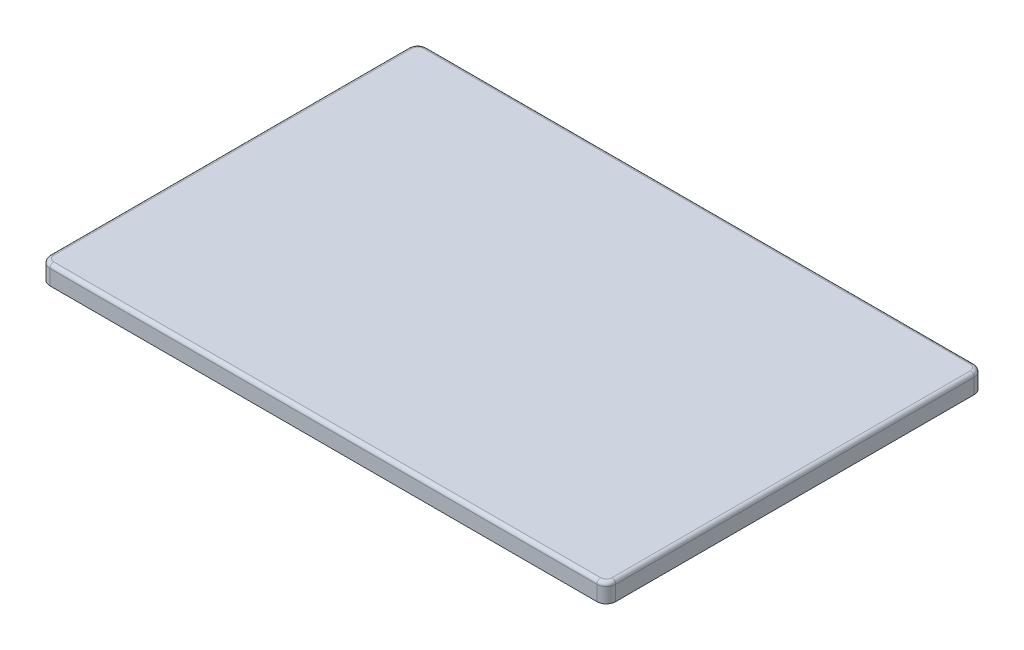
ISO-10303-21;
HEADER;
FILE_DESCRIPTION(('STEP AP214'),'2;1');
FILE_NAME('part.step','',(''),(''),'','','');
FILE_SCHEMA(('AUTOMOTIVE_DESIGN { 1 0 10303 214 1 1 1 1 }'));
ENDSEC;
DATA;
#1=APPLICATION_CONTEXT('core data for automotive mechanical design processes');
#2=APPLICATION_PROTOCOL_DEFINITION('international standard','automotive_design',2000,#1);
#3=PRODUCT_CONTEXT('',#1,'mechanical');
#4=PRODUCT('Part','Part','',(#3));
#5=PRODUCT_RELATED_PRODUCT_CATEGORY('part','',(#4));
#6=PRODUCT_DEFINITION_FORMATION('','',#4);
#7=PRODUCT_DEFINITION_CONTEXT('part definition',#1,'design');
#8=PRODUCT_DEFINITION('design','',#6,#7);
#9=PRODUCT_DEFINITION_SHAPE('','',#8);
#10=(LENGTH_UNIT() NAMED_UNIT(*) SI_UNIT(.MILLI.,.METRE.));
#11=(NAMED_UNIT(*) PLANE_ANGLE_UNIT() SI_UNIT($,.RADIAN.));
#12=(NAMED_UNIT(*) SI_UNIT($,.STERADIAN.) SOLID_ANGLE_UNIT());
#13=UNCERTAINTY_MEASURE_WITH_UNIT(LENGTH_MEASURE(1.E-05),#10,'distance_accuracy_value','');
#14=(GEOMETRIC_REPRESENTATION_CONTEXT(3) GLOBAL_UNCERTAINTY_ASSIGNED_CONTEXT((#13)) GLOBAL_UNIT_ASSIGNED_CONTEXT((#10,
#11,#12)) REPRESENTATION_CONTEXT('',''));
#15=CARTESIAN_POINT('',(0.,0.,0.));
#16=DIRECTION('',(0.,0.,1.));
#17=DIRECTION('',(1.,0.,0.));
#18=AXIS2_PLACEMENT_3D('',#15,#16,#17);
#19=CARTESIAN_POINT('',(145.,0.,-95.));
#20=DIRECTION('',(0.,-1.,0.));
#21=DIRECTION('',(0.,0.,-1.));
#22=AXIS2_PLACEMENT_3D('',#19,#20,#21);
#23=PLANE('',#22);
#24=CARTESIAN_POINT('',(145.,0.,-95.));
#25=DIRECTION('',(0.,1.,0.));
#26=DIRECTION('',(0.,0.,-1.));
#27=AXIS2_PLACEMENT_3D('',#24,#25,#26);
#28=CIRCLE('',#27,5.);
#29=CARTESIAN_POINT('',(150.,0.,-95.));
#30=VERTEX_POINT('',#29);
#31=CARTESIAN_POINT('',(145.,0.,-100.));
#32=VERTEX_POINT('',#31);
#33=EDGE_CURVE('E198',#30,#32,#28,.T.);
#34=ORIENTED_EDGE('',*,*,#33,.F.);
#35=DIRECTION('',(0.,0.,-1.));
#36=VECTOR('',#35,1.);
#37=CARTESIAN_POINT('',(150.,0.,-95.));
#38=LINE('',#37,#36);
#39=CARTESIAN_POINT('',(150.,0.,95.));
#40=VERTEX_POINT('',#39);
#41=EDGE_CURVE('E265',#40,#30,#38,.T.);
#42=ORIENTED_EDGE('',*,*,#41,.F.);
#43=CARTESIAN_POINT('',(145.,0.,95.));
#44=DIRECTION('',(0.,1.,0.));
#45=DIRECTION('',(0.,0.,1.));
#46=AXIS2_PLACEMENT_3D('',#43,#44,#45);
#47=CIRCLE('',#46,5.00000000000003);
#48=CARTESIAN_POINT('',(145.,0.,100.));
#49=VERTEX_POINT('',#48);
#50=EDGE_CURVE('E262',#49,#40,#47,.T.);
#51=ORIENTED_EDGE('',*,*,#50,.F.);
#52=DIRECTION('',(1.,0.,0.));
#53=VECTOR('',#52,1.);
#54=CARTESIAN_POINT('',(-145.,0.,100.));
#55=LINE('',#54,#53);
#56=CARTESIAN_POINT('',(-145.,0.,100.));
#57=VERTEX_POINT('',#56);
#58=EDGE_CURVE('E259',#57,#49,#55,.T.);
#59=ORIENTED_EDGE('',*,*,#58,.F.);
#60=CARTESIAN_POINT('',(-145.,0.,95.));
#61=DIRECTION('',(0.,1.,0.));
#62=DIRECTION('',(0.,0.,1.));
#63=AXIS2_PLACEMENT_3D('',#60,#61,#62);
#64=CIRCLE('',#63,5.00000000000002);
#65=CARTESIAN_POINT('',(-150.,0.,95.));
#66=VERTEX_POINT('',#65);
#67=EDGE_CURVE('E256',#66,#57,#64,.T.);
#68=ORIENTED_EDGE('',*,*,#67,.F.);
#69=DIRECTION('',(0.,0.,1.));
#70=VECTOR('',#69,1.);
#71=CARTESIAN_POINT('',(-150.,0.,-95.));
#72=LINE('',#71,#70);
#73=CARTESIAN_POINT('',(-150.,0.,-95.));
#74=VERTEX_POINT('',#73);
#75=EDGE_CURVE('E253',#74,#66,#72,.T.);
#76=ORIENTED_EDGE('',*,*,#75,.F.);
#77=CARTESIAN_POINT('',(-145.,0.,-95.));
#78=DIRECTION('',(0.,1.,0.));
#79=DIRECTION('',(0.,0.,1.));
#80=AXIS2_PLACEMENT_3D('',#77,#78,#79);
#81=CIRCLE('',#80,5.);
#82=CARTESIAN_POINT('',(-145.,0.,-100.));
#83=VERTEX_POINT('',#82);
#84=EDGE_CURVE('E250',#83,#74,#81,.T.);
#85=ORIENTED_EDGE('',*,*,#84,.F.);
#86=DIRECTION('',(-1.,0.,0.));
#87=VECTOR('',#86,1.);
#88=CARTESIAN_POINT('',(-145.,0.,-100.));
#89=LINE('',#88,#87);
#90=EDGE_CURVE('E202',#32,#83,#89,.T.);
#91=ORIENTED_EDGE('',*,*,#90,.F.);
#92=EDGE_LOOP('',(#34,#42,#51,#59,#68,#76,#85,#91));
#93=FACE_BOUND('',#92,.T.);
#94=DIRECTION('',(0.,0.,-1.));
#95=VECTOR('',#94,1.);
#96=CARTESIAN_POINT('',(147.,0.,-95.));
#97=LINE('',#96,#95);
#98=CARTESIAN_POINT('',(147.,0.,95.));
#99=VERTEX_POINT('',#98);
#100=CARTESIAN_POINT('',(147.,0.,-95.));
#101=VERTEX_POINT('',#100);
#102=EDGE_CURVE('E193',#99,#101,#97,.T.);
#103=ORIENTED_EDGE('',*,*,#102,.T.);
#104=CARTESIAN_POINT('',(145.,0.,-95.));
#105=DIRECTION('',(0.,-1.,0.));
#106=DIRECTION('',(0.,0.,-1.));
#107=AXIS2_PLACEMENT_3D('',#104,#105,#106);
#108=CIRCLE('',#107,2.);
#109=CARTESIAN_POINT('',(145.,0.,-97.));
#110=VERTEX_POINT('',#109);
#111=EDGE_CURVE('E228',#101,#110,#108,.F.);
#112=ORIENTED_EDGE('',*,*,#111,.T.);
#113=DIRECTION('',(-1.,0.,0.));
#114=VECTOR('',#113,1.);
#115=CARTESIAN_POINT('',(145.,0.,-97.));
#116=LINE('',#115,#114);
#117=CARTESIAN_POINT('',(-145.,0.,-97.));
#118=VERTEX_POINT('',#117);
#119=EDGE_CURVE('E197',#110,#118,#116,.T.);
#120=ORIENTED_EDGE('',*,*,#119,.T.);
#121=CARTESIAN_POINT('',(-145.,0.,-95.));
#122=DIRECTION('',(0.,-1.,0.));
#123=DIRECTION('',(0.,0.,-1.));
#124=AXIS2_PLACEMENT_3D('',#121,#122,#123);
#125=CIRCLE('',#124,2.);
#126=CARTESIAN_POINT('',(-147.,0.,-95.));
#127=VERTEX_POINT('',#126);
#128=EDGE_CURVE('E244',#118,#127,#125,.F.);
#129=ORIENTED_EDGE('',*,*,#128,.T.);
#130=DIRECTION('',(0.,0.,1.));
#131=VECTOR('',#130,1.);
#132=CARTESIAN_POINT('',(-147.,0.,-95.));
#133=LINE('',#132,#131);
#134=CARTESIAN_POINT('',(-147.,0.,95.));
#135=VERTEX_POINT('',#134);
#136=EDGE_CURVE('E241',#127,#135,#133,.T.);
#137=ORIENTED_EDGE('',*,*,#136,.T.);
#138=CARTESIAN_POINT('',(-145.,0.,95.));
#139=DIRECTION('',(0.,-1.,0.));
#140=DIRECTION('',(0.,0.,-1.));
#141=AXIS2_PLACEMENT_3D('',#138,#139,#140);
#142=CIRCLE('',#141,2.00000000000002);
#143=CARTESIAN_POINT('',(-145.,0.,97.));
#144=VERTEX_POINT('',#143);
#145=EDGE_CURVE('E238',#135,#144,#142,.F.);
#146=ORIENTED_EDGE('',*,*,#145,.T.);
#147=DIRECTION('',(1.,0.,0.));
#148=VECTOR('',#147,1.);
#149=CARTESIAN_POINT('',(145.,0.,97.));
#150=LINE('',#149,#148);
#151=CARTESIAN_POINT('',(145.,0.,97.));
#152=VERTEX_POINT('',#151);
#153=EDGE_CURVE('E235',#144,#152,#150,.T.);
#154=ORIENTED_EDGE('',*,*,#153,.T.);
#155=CARTESIAN_POINT('',(145.,0.,95.));
#156=DIRECTION('',(0.,-1.,0.));
#157=DIRECTION('',(0.,0.,-1.));
#158=AXIS2_PLACEMENT_3D('',#155,#156,#157);
#159=CIRCLE('',#158,2.00000000000003);
#160=EDGE_CURVE('E232',#152,#99,#159,.F.);
#161=ORIENTED_EDGE('',*,*,#160,.T.);
#162=EDGE_LOOP('',(#103,#112,#120,#129,#137,#146,#154,#161));
#163=FACE_BOUND('',#162,.T.);
#164=ADVANCED_FACE('F36',(#93,#163),#23,.T.);
#165=CARTESIAN_POINT('',(145.,10.,-95.));
#166=DIRECTION('',(0.,-1.,0.));
#167=DIRECTION('',(0.,0.,-1.));
#168=AXIS2_PLACEMENT_3D('',#165,#166,#167);
#169=CYLINDRICAL_SURFACE('',#168,5.);
#170=DIRECTION('',(0.,-1.,0.));
#171=VECTOR('',#170,1.);
#172=CARTESIAN_POINT('',(145.,10.,-100.));
#173=LINE('',#172,#171);
#174=CARTESIAN_POINT('',(145.,8.,-100.));
#175=VERTEX_POINT('',#174);
#176=EDGE_CURVE('E282',#175,#32,#173,.T.);
#177=ORIENTED_EDGE('',*,*,#176,.F.);
#178=CARTESIAN_POINT('',(145.,8.,-95.));
#179=DIRECTION('',(0.,-1.,0.));
#180=DIRECTION('',(0.,0.,-1.));
#181=AXIS2_PLACEMENT_3D('',#178,#179,#180);
#182=CIRCLE('',#181,5.);
#183=CARTESIAN_POINT('',(150.,8.,-95.));
#184=VERTEX_POINT('',#183);
#185=EDGE_CURVE('E306',#175,#184,#182,.T.);
#186=ORIENTED_EDGE('',*,*,#185,.T.);
#187=DIRECTION('',(0.,-1.,0.));
#188=VECTOR('',#187,1.);
#189=CARTESIAN_POINT('',(150.,10.,-95.));
#190=LINE('',#189,#188);
#191=EDGE_CURVE('E268',#184,#30,#190,.T.);
#192=ORIENTED_EDGE('',*,*,#191,.T.);
#193=ORIENTED_EDGE('',*,*,#33,.T.);
#194=EDGE_LOOP('',(#177,#186,#192,#193));
#195=FACE_BOUND('',#194,.T.);
#196=ADVANCED_FACE('F403',(#195),#169,.T.);
#197=CARTESIAN_POINT('',(-145.,10.,-100.));
#198=DIRECTION('',(0.,0.,1.));
#199=DIRECTION('',(1.,0.,0.));
#200=AXIS2_PLACEMENT_3D('',#197,#198,#199);
#201=PLANE('',#200);
#202=DIRECTION('',(0.,-1.,0.));
#203=VECTOR('',#202,1.);
#204=CARTESIAN_POINT('',(-145.,10.,-100.));
#205=LINE('',#204,#203);
#206=CARTESIAN_POINT('',(-145.,8.,-100.));
#207=VERTEX_POINT('',#206);
#208=EDGE_CURVE('E280',#207,#83,#205,.T.);
#209=ORIENTED_EDGE('',*,*,#208,.F.);
#210=DIRECTION('',(-1.,0.,0.));
#211=VECTOR('',#210,1.);
#212=CARTESIAN_POINT('',(-145.,8.,-100.));
#213=LINE('',#212,#211);
#214=EDGE_CURVE('E308',#207,#175,#213,.F.);
#215=ORIENTED_EDGE('',*,*,#214,.T.);
#216=ORIENTED_EDGE('',*,*,#176,.T.);
#217=ORIENTED_EDGE('',*,*,#90,.T.);
#218=EDGE_LOOP('',(#209,#215,#216,#217));
#219=FACE_BOUND('',#218,.T.);
#220=ADVANCED_FACE('F351',(#219),#201,.F.);
#221=CARTESIAN_POINT('',(-145.,10.,-95.));
#222=DIRECTION('',(0.,-1.,0.));
#223=DIRECTION('',(0.,0.,-1.));
#224=AXIS2_PLACEMENT_3D('',#221,#222,#223);
#225=CYLINDRICAL_SURFACE('',#224,5.);
#226=DIRECTION('',(0.,-1.,0.));
#227=VECTOR('',#226,1.);
#228=CARTESIAN_POINT('',(-150.,10.,-95.));
#229=LINE('',#228,#227);
#230=CARTESIAN_POINT('',(-150.,8.,-95.));
#231=VERTEX_POINT('',#230);
#232=EDGE_CURVE('E278',#231,#74,#229,.T.);
#233=ORIENTED_EDGE('',*,*,#232,.F.);
#234=CARTESIAN_POINT('',(-145.,8.,-95.));
#235=DIRECTION('',(0.,-1.,0.));
#236=DIRECTION('',(0.,0.,-1.));
#237=AXIS2_PLACEMENT_3D('',#234,#235,#236);
#238=CIRCLE('',#237,5.);
#239=EDGE_CURVE('E310',#231,#207,#238,.T.);
#240=ORIENTED_EDGE('',*,*,#239,.T.);
#241=ORIENTED_EDGE('',*,*,#208,.T.);
#242=ORIENTED_EDGE('',*,*,#84,.T.);
#243=EDGE_LOOP('',(#233,#240,#241,#242));
#244=FACE_BOUND('',#243,.T.);
#245=ADVANCED_FACE('F349',(#244),#225,.T.);
#246=CARTESIAN_POINT('',(-150.,10.,-95.));
#247=DIRECTION('',(1.,0.,0.));
#248=DIRECTION('',(0.,0.,-1.));
#249=AXIS2_PLACEMENT_3D('',#246,#247,#248);
#250=PLANE('',#249);
#251=DIRECTION('',(0.,-1.,0.));
#252=VECTOR('',#251,1.);
#253=CARTESIAN_POINT('',(-150.,10.,95.));
#254=LINE('',#253,#252);
#255=CARTESIAN_POINT('',(-150.,8.,95.));
#256=VERTEX_POINT('',#255);
#257=EDGE_CURVE('E276',#256,#66,#254,.T.);
#258=ORIENTED_EDGE('',*,*,#257,.F.);
#259=DIRECTION('',(0.,0.,1.));
#260=VECTOR('',#259,1.);
#261=CARTESIAN_POINT('',(-150.,8.,-95.));
#262=LINE('',#261,#260);
#263=EDGE_CURVE('E312',#256,#231,#262,.F.);
#264=ORIENTED_EDGE('',*,*,#263,.T.);
#265=ORIENTED_EDGE('',*,*,#232,.T.);
#266=ORIENTED_EDGE('',*,*,#75,.T.);
#267=EDGE_LOOP('',(#258,#264,#265,#266));
#268=FACE_BOUND('',#267,.T.);
#269=ADVANCED_FACE('F362',(#268),#250,.F.);
#270=CARTESIAN_POINT('',(-145.,10.,95.));
#271=DIRECTION('',(0.,-1.,0.));
#272=DIRECTION('',(0.,0.,-1.));
#273=AXIS2_PLACEMENT_3D('',#270,#271,#272);
#274=CYLINDRICAL_SURFACE('',#273,5.00000000000002);
#275=DIRECTION('',(0.,-1.,0.));
#276=VECTOR('',#275,1.);
#277=CARTESIAN_POINT('',(-145.,10.,100.));
#278=LINE('',#277,#276);
#279=CARTESIAN_POINT('',(-145.,8.,100.));
#280=VERTEX_POINT('',#279);
#281=EDGE_CURVE('E274',#280,#57,#278,.T.);
#282=ORIENTED_EDGE('',*,*,#281,.F.);
#283=CARTESIAN_POINT('',(-145.,8.,95.));
#284=DIRECTION('',(0.,-1.,0.));
#285=DIRECTION('',(0.,0.,-1.));
#286=AXIS2_PLACEMENT_3D('',#283,#284,#285);
#287=CIRCLE('',#286,5.00000000000002);
#288=EDGE_CURVE('E45',#280,#256,#287,.T.);
#289=ORIENTED_EDGE('',*,*,#288,.T.);
#290=ORIENTED_EDGE('',*,*,#257,.T.);
#291=ORIENTED_EDGE('',*,*,#67,.T.);
#292=EDGE_LOOP('',(#282,#289,#290,#291));
#293=FACE_BOUND('',#292,.T.);
#294=ADVANCED_FACE('F363',(#293),#274,.T.);
#295=CARTESIAN_POINT('',(-145.,10.,100.));
#296=DIRECTION('',(0.,0.,-1.));
#297=DIRECTION('',(-1.,0.,0.));
#298=AXIS2_PLACEMENT_3D('',#295,#296,#297);
#299=PLANE('',#298);
#300=DIRECTION('',(0.,-1.,0.));
#301=VECTOR('',#300,1.);
#302=CARTESIAN_POINT('',(145.,10.,100.));
#303=LINE('',#302,#301);
#304=CARTESIAN_POINT('',(145.,8.,100.));
#305=VERTEX_POINT('',#304);
#306=EDGE_CURVE('E272',#305,#49,#303,.T.);
#307=ORIENTED_EDGE('',*,*,#306,.F.);
#308=DIRECTION('',(1.,0.,0.));
#309=VECTOR('',#308,1.);
#310=CARTESIAN_POINT('',(-145.,8.,100.));
#311=LINE('',#310,#309);
#312=EDGE_CURVE('E11',#305,#280,#311,.F.);
#313=ORIENTED_EDGE('',*,*,#312,.T.);
#314=ORIENTED_EDGE('',*,*,#281,.T.);
#315=ORIENTED_EDGE('',*,*,#58,.T.);
#316=EDGE_LOOP('',(#307,#313,#314,#315));
#317=FACE_BOUND('',#316,.T.);
#318=ADVANCED_FACE('F366',(#317),#299,.F.);
#319=CARTESIAN_POINT('',(145.,10.,95.));
#320=DIRECTION('',(0.,-1.,0.));
#321=DIRECTION('',(0.,0.,-1.));
#322=AXIS2_PLACEMENT_3D('',#319,#320,#321);
#323=CYLINDRICAL_SURFACE('',#322,5.00000000000003);
#324=DIRECTION('',(0.,-1.,0.));
#325=VECTOR('',#324,1.);
#326=CARTESIAN_POINT('',(150.,10.,95.));
#327=LINE('',#326,#325);
#328=CARTESIAN_POINT('',(150.,8.,95.));
#329=VERTEX_POINT('',#328);
#330=EDGE_CURVE('E270',#329,#40,#327,.T.);
#331=ORIENTED_EDGE('',*,*,#330,.F.);
#332=CARTESIAN_POINT('',(145.,8.,95.));
#333=DIRECTION('',(0.,-1.,0.));
#334=DIRECTION('',(0.,0.,-1.));
#335=AXIS2_PLACEMENT_3D('',#332,#333,#334);
#336=CIRCLE('',#335,5.00000000000003);
#337=EDGE_CURVE('E301',#329,#305,#336,.T.);
#338=ORIENTED_EDGE('',*,*,#337,.T.);
#339=ORIENTED_EDGE('',*,*,#306,.T.);
#340=ORIENTED_EDGE('',*,*,#50,.T.);
#341=EDGE_LOOP('',(#331,#338,#339,#340));
#342=FACE_BOUND('',#341,.T.);
#343=ADVANCED_FACE('F369',(#342),#323,.T.);
#344=CARTESIAN_POINT('',(150.,10.,-95.));
#345=DIRECTION('',(-1.,0.,0.));
#346=DIRECTION('',(0.,0.,1.));
#347=AXIS2_PLACEMENT_3D('',#344,#345,#346);
#348=PLANE('',#347);
#349=ORIENTED_EDGE('',*,*,#191,.F.);
#350=DIRECTION('',(0.,0.,-1.));
#351=VECTOR('',#350,1.);
#352=CARTESIAN_POINT('',(150.,8.,-95.));
#353=LINE('',#352,#351);
#354=EDGE_CURVE('E304',#184,#329,#353,.F.);
#355=ORIENTED_EDGE('',*,*,#354,.T.);
#356=ORIENTED_EDGE('',*,*,#330,.T.);
#357=ORIENTED_EDGE('',*,*,#41,.T.);
#358=EDGE_LOOP('',(#349,#355,#356,#357));
#359=FACE_BOUND('',#358,.T.);
#360=ADVANCED_FACE('F413',(#359),#348,.F.);
#361=CARTESIAN_POINT('',(145.,10.,-95.));
#362=DIRECTION('',(0.,-1.,0.));
#363=DIRECTION('',(0.,0.,-1.));
#364=AXIS2_PLACEMENT_3D('',#361,#362,#363);
#365=PLANE('',#364);
#366=DIRECTION('',(1.,0.,0.));
#367=VECTOR('',#366,1.);
#368=CARTESIAN_POINT('',(145.,10.,98.));
#369=LINE('',#368,#367);
#370=CARTESIAN_POINT('',(-145.,10.,98.));
#371=VERTEX_POINT('',#370);
#372=CARTESIAN_POINT('',(145.,10.,98.));
#373=VERTEX_POINT('',#372);
#374=EDGE_CURVE('E284',#371,#373,#369,.T.);
#375=ORIENTED_EDGE('',*,*,#374,.T.);
#376=CARTESIAN_POINT('',(145.,10.,95.));
#377=DIRECTION('',(0.,-1.,0.));
#378=DIRECTION('',(0.,0.,-1.));
#379=AXIS2_PLACEMENT_3D('',#376,#377,#378);
#380=CIRCLE('',#379,3.00000000000003);
#381=CARTESIAN_POINT('',(148.,10.,95.));
#382=VERTEX_POINT('',#381);
#383=EDGE_CURVE('E298',#373,#382,#380,.F.);
#384=ORIENTED_EDGE('',*,*,#383,.T.);
#385=DIRECTION('',(0.,0.,-1.));
#386=VECTOR('',#385,1.);
#387=CARTESIAN_POINT('',(148.,10.,-95.));
#388=LINE('',#387,#386);
#389=CARTESIAN_POINT('',(148.,10.,-95.));
#390=VERTEX_POINT('',#389);
#391=EDGE_CURVE('E296',#382,#390,#388,.T.);
#392=ORIENTED_EDGE('',*,*,#391,.T.);
#393=CARTESIAN_POINT('',(145.,10.,-95.));
#394=DIRECTION('',(0.,-1.,0.));
#395=DIRECTION('',(0.,0.,-1.));
#396=AXIS2_PLACEMENT_3D('',#393,#394,#395);
#397=CIRCLE('',#396,3.);
#398=CARTESIAN_POINT('',(145.,10.,-98.));
#399=VERTEX_POINT('',#398);
#400=EDGE_CURVE('E294',#390,#399,#397,.F.);
#401=ORIENTED_EDGE('',*,*,#400,.T.);
#402=DIRECTION('',(-1.,0.,0.));
#403=VECTOR('',#402,1.);
#404=CARTESIAN_POINT('',(145.,10.,-98.));
#405=LINE('',#404,#403);
#406=CARTESIAN_POINT('',(-145.,10.,-98.));
#407=VERTEX_POINT('',#406);
#408=EDGE_CURVE('E292',#399,#407,#405,.T.);
#409=ORIENTED_EDGE('',*,*,#408,.T.);
#410=CARTESIAN_POINT('',(-145.,10.,-95.));
#411=DIRECTION('',(0.,-1.,0.));
#412=DIRECTION('',(0.,0.,-1.));
#413=AXIS2_PLACEMENT_3D('',#410,#411,#412);
#414=CIRCLE('',#413,3.);
#415=CARTESIAN_POINT('',(-148.,10.,-95.));
#416=VERTEX_POINT('',#415);
#417=EDGE_CURVE('E290',#407,#416,#414,.F.);
#418=ORIENTED_EDGE('',*,*,#417,.T.);
#419=DIRECTION('',(0.,0.,1.));
#420=VECTOR('',#419,1.);
#421=CARTESIAN_POINT('',(-148.,10.,-95.));
#422=LINE('',#421,#420);
#423=CARTESIAN_POINT('',(-148.,10.,95.));
#424=VERTEX_POINT('',#423);
#425=EDGE_CURVE('E288',#416,#424,#422,.T.);
#426=ORIENTED_EDGE('',*,*,#425,.T.);
#427=CARTESIAN_POINT('',(-145.,10.,95.));
#428=DIRECTION('',(0.,-1.,0.));
#429=DIRECTION('',(0.,0.,-1.));
#430=AXIS2_PLACEMENT_3D('',#427,#428,#429);
#431=CIRCLE('',#430,3.00000000000002);
#432=EDGE_CURVE('E286',#424,#371,#431,.F.);
#433=ORIENTED_EDGE('',*,*,#432,.T.);
#434=EDGE_LOOP('',(#375,#384,#392,#401,#409,#418,#426,#433));
#435=FACE_BOUND('',#434,.T.);
#436=ADVANCED_FACE('F383',(#435),#365,.F.);
#437=CARTESIAN_POINT('',(145.,10.,-95.));
#438=DIRECTION('',(0.,-1.,0.));
#439=DIRECTION('',(0.,0.,-1.));
#440=AXIS2_PLACEMENT_3D('',#437,#438,#439);
#441=CYLINDRICAL_SURFACE('',#440,2.);
#442=ORIENTED_EDGE('',*,*,#111,.F.);
#443=DIRECTION('',(0.,-1.,0.));
#444=VECTOR('',#443,1.);
#445=CARTESIAN_POINT('',(147.,10.,-95.));
#446=LINE('',#445,#444);
#447=CARTESIAN_POINT('',(147.,7.,-95.));
#448=VERTEX_POINT('',#447);
#449=EDGE_CURVE('E192',#448,#101,#446,.T.);
#450=ORIENTED_EDGE('',*,*,#449,.F.);
#451=CARTESIAN_POINT('',(145.,7.,-95.));
#452=DIRECTION('',(0.,-1.,0.));
#453=DIRECTION('',(0.,0.,-1.));
#454=AXIS2_PLACEMENT_3D('',#451,#452,#453);
#455=CIRCLE('',#454,2.);
#456=CARTESIAN_POINT('',(145.,7.,-97.));
#457=VERTEX_POINT('',#456);
#458=EDGE_CURVE('E177',#448,#457,#455,.F.);
#459=ORIENTED_EDGE('',*,*,#458,.T.);
#460=DIRECTION('',(0.,1.,0.));
#461=VECTOR('',#460,1.);
#462=CARTESIAN_POINT('',(145.,10.,-97.));
#463=LINE('',#462,#461);
#464=EDGE_CURVE('E190',#457,#110,#463,.F.);
#465=ORIENTED_EDGE('',*,*,#464,.T.);
#466=EDGE_LOOP('',(#442,#450,#459,#465));
#467=FACE_BOUND('',#466,.T.);
#468=ADVANCED_FACE('F189',(#467),#441,.F.);
#469=CARTESIAN_POINT('',(-145.,10.,-97.));
#470=DIRECTION('',(0.,0.,1.));
#471=DIRECTION('',(1.,0.,0.));
#472=AXIS2_PLACEMENT_3D('',#469,#470,#471);
#473=PLANE('',#472);
#474=ORIENTED_EDGE('',*,*,#119,.F.);
#475=ORIENTED_EDGE('',*,*,#464,.F.);
#476=DIRECTION('',(-1.,0.,0.));
#477=VECTOR('',#476,1.);
#478=CARTESIAN_POINT('',(145.,7.,-97.));
#479=LINE('',#478,#477);
#480=CARTESIAN_POINT('',(-145.,7.,-97.));
#481=VERTEX_POINT('',#480);
#482=EDGE_CURVE('E173',#457,#481,#479,.T.);
#483=ORIENTED_EDGE('',*,*,#482,.T.);
#484=DIRECTION('',(0.,-1.,0.));
#485=VECTOR('',#484,1.);
#486=CARTESIAN_POINT('',(-145.,10.,-97.));
#487=LINE('',#486,#485);
#488=EDGE_CURVE('E199',#481,#118,#487,.T.);
#489=ORIENTED_EDGE('',*,*,#488,.T.);
#490=EDGE_LOOP('',(#474,#475,#483,#489));
#491=FACE_BOUND('',#490,.T.);
#492=ADVANCED_FACE('F195',(#491),#473,.T.);
#493=CARTESIAN_POINT('',(-145.,10.,-95.));
#494=DIRECTION('',(0.,-1.,0.));
#495=DIRECTION('',(0.,0.,-1.));
#496=AXIS2_PLACEMENT_3D('',#493,#494,#495);
#497=CYLINDRICAL_SURFACE('',#496,2.);
#498=ORIENTED_EDGE('',*,*,#128,.F.);
#499=ORIENTED_EDGE('',*,*,#488,.F.);
#500=CARTESIAN_POINT('',(-145.,7.,-95.));
#501=DIRECTION('',(0.,-1.,0.));
#502=DIRECTION('',(0.,0.,-1.));
#503=AXIS2_PLACEMENT_3D('',#500,#501,#502);
#504=CIRCLE('',#503,2.);
#505=CARTESIAN_POINT('',(-147.,7.,-95.));
#506=VERTEX_POINT('',#505);
#507=EDGE_CURVE('E179',#481,#506,#504,.F.);
#508=ORIENTED_EDGE('',*,*,#507,.T.);
#509=DIRECTION('',(0.,1.,0.));
#510=VECTOR('',#509,1.);
#511=CARTESIAN_POINT('',(-147.,10.,-95.));
#512=LINE('',#511,#510);
#513=EDGE_CURVE('E204',#506,#127,#512,.F.);
#514=ORIENTED_EDGE('',*,*,#513,.T.);
#515=EDGE_LOOP('',(#498,#499,#508,#514));
#516=FACE_BOUND('',#515,.T.);
#517=ADVANCED_FACE('F530',(#516),#497,.F.);
#518=CARTESIAN_POINT('',(-147.,10.,-95.));
#519=DIRECTION('',(1.,0.,0.));
#520=DIRECTION('',(0.,0.,-1.));
#521=AXIS2_PLACEMENT_3D('',#518,#519,#520);
#522=PLANE('',#521);
#523=ORIENTED_EDGE('',*,*,#136,.F.);
#524=ORIENTED_EDGE('',*,*,#513,.F.);
#525=DIRECTION('',(0.,0.,1.));
#526=VECTOR('',#525,1.);
#527=CARTESIAN_POINT('',(-147.,7.,-95.));
#528=LINE('',#527,#526);
#529=CARTESIAN_POINT('',(-147.,7.,95.));
#530=VERTEX_POINT('',#529);
#531=EDGE_CURVE('E213',#506,#530,#528,.T.);
#532=ORIENTED_EDGE('',*,*,#531,.T.);
#533=DIRECTION('',(0.,-1.,0.));
#534=VECTOR('',#533,1.);
#535=CARTESIAN_POINT('',(-147.,10.,95.));
#536=LINE('',#535,#534);
#537=EDGE_CURVE('E211',#530,#135,#536,.T.);
#538=ORIENTED_EDGE('',*,*,#537,.T.);
#539=EDGE_LOOP('',(#523,#524,#532,#538));
#540=FACE_BOUND('',#539,.T.);
#541=ADVANCED_FACE('F521',(#540),#522,.T.);
#542=CARTESIAN_POINT('',(-145.,10.,95.));
#543=DIRECTION('',(0.,-1.,0.));
#544=DIRECTION('',(0.,0.,-1.));
#545=AXIS2_PLACEMENT_3D('',#542,#543,#544);
#546=CYLINDRICAL_SURFACE('',#545,2.00000000000002);
#547=ORIENTED_EDGE('',*,*,#145,.F.);
#548=ORIENTED_EDGE('',*,*,#537,.F.);
#549=CARTESIAN_POINT('',(-145.,7.,95.));
#550=DIRECTION('',(0.,-1.,0.));
#551=DIRECTION('',(0.,0.,-1.));
#552=AXIS2_PLACEMENT_3D('',#549,#550,#551);
#553=CIRCLE('',#552,2.00000000000002);
#554=CARTESIAN_POINT('',(-145.,7.,97.));
#555=VERTEX_POINT('',#554);
#556=EDGE_CURVE('E217',#530,#555,#553,.F.);
#557=ORIENTED_EDGE('',*,*,#556,.T.);
#558=DIRECTION('',(0.,1.,0.));
#559=VECTOR('',#558,1.);
#560=CARTESIAN_POINT('',(-145.,10.,97.));
#561=LINE('',#560,#559);
#562=EDGE_CURVE('E215',#555,#144,#561,.F.);
#563=ORIENTED_EDGE('',*,*,#562,.T.);
#564=EDGE_LOOP('',(#547,#548,#557,#563));
#565=FACE_BOUND('',#564,.T.);
#566=ADVANCED_FACE('F512',(#565),#546,.F.);
#567=CARTESIAN_POINT('',(-145.,10.,97.));
#568=DIRECTION('',(0.,0.,-1.));
#569=DIRECTION('',(-1.,0.,0.));
#570=AXIS2_PLACEMENT_3D('',#567,#568,#569);
#571=PLANE('',#570);
#572=ORIENTED_EDGE('',*,*,#153,.F.);
#573=ORIENTED_EDGE('',*,*,#562,.F.);
#574=DIRECTION('',(1.,0.,0.));
#575=VECTOR('',#574,1.);
#576=CARTESIAN_POINT('',(145.,7.,97.));
#577=LINE('',#576,#575);
#578=CARTESIAN_POINT('',(145.,7.,97.));
#579=VERTEX_POINT('',#578);
#580=EDGE_CURVE('E221',#555,#579,#577,.T.);
#581=ORIENTED_EDGE('',*,*,#580,.T.);
#582=DIRECTION('',(0.,-1.,0.));
#583=VECTOR('',#582,1.);
#584=CARTESIAN_POINT('',(145.,10.,97.));
#585=LINE('',#584,#583);
#586=EDGE_CURVE('E219',#579,#152,#585,.T.);
#587=ORIENTED_EDGE('',*,*,#586,.T.);
#588=EDGE_LOOP('',(#572,#573,#581,#587));
#589=FACE_BOUND('',#588,.T.);
#590=ADVANCED_FACE('F503',(#589),#571,.T.);
#591=CARTESIAN_POINT('',(145.,10.,95.));
#592=DIRECTION('',(0.,-1.,0.));
#593=DIRECTION('',(0.,0.,-1.));
#594=AXIS2_PLACEMENT_3D('',#591,#592,#593);
#595=CYLINDRICAL_SURFACE('',#594,2.00000000000003);
#596=ORIENTED_EDGE('',*,*,#160,.F.);
#597=ORIENTED_EDGE('',*,*,#586,.F.);
#598=CARTESIAN_POINT('',(145.,7.,95.));
#599=DIRECTION('',(0.,-1.,0.));
#600=DIRECTION('',(0.,0.,-1.));
#601=AXIS2_PLACEMENT_3D('',#598,#599,#600);
#602=CIRCLE('',#601,2.00000000000003);
#603=CARTESIAN_POINT('',(147.,7.,95.));
#604=VERTEX_POINT('',#603);
#605=EDGE_CURVE('E224',#579,#604,#602,.F.);
#606=ORIENTED_EDGE('',*,*,#605,.T.);
#607=DIRECTION('',(0.,1.,0.));
#608=VECTOR('',#607,1.);
#609=CARTESIAN_POINT('',(147.,10.,95.));
#610=LINE('',#609,#608);
#611=EDGE_CURVE('E207',#604,#99,#610,.F.);
#612=ORIENTED_EDGE('',*,*,#611,.T.);
#613=EDGE_LOOP('',(#596,#597,#606,#612));
#614=FACE_BOUND('',#613,.T.);
#615=ADVANCED_FACE('F494',(#614),#595,.F.);
#616=CARTESIAN_POINT('',(147.,10.,-95.));
#617=DIRECTION('',(-1.,0.,0.));
#618=DIRECTION('',(0.,0.,1.));
#619=AXIS2_PLACEMENT_3D('',#616,#617,#618);
#620=PLANE('',#619);
#621=ORIENTED_EDGE('',*,*,#102,.F.);
#622=ORIENTED_EDGE('',*,*,#611,.F.);
#623=DIRECTION('',(0.,0.,-1.));
#624=VECTOR('',#623,1.);
#625=CARTESIAN_POINT('',(147.,7.,-95.));
#626=LINE('',#625,#624);
#627=EDGE_CURVE('E208',#604,#448,#626,.T.);
#628=ORIENTED_EDGE('',*,*,#627,.T.);
#629=ORIENTED_EDGE('',*,*,#449,.T.);
#630=EDGE_LOOP('',(#621,#622,#628,#629));
#631=FACE_BOUND('',#630,.T.);
#632=ADVANCED_FACE('F486',(#631),#620,.T.);
#633=CARTESIAN_POINT('',(145.,7.,-95.));
#634=DIRECTION('',(0.,-1.,0.));
#635=DIRECTION('',(0.,0.,-1.));
#636=AXIS2_PLACEMENT_3D('',#633,#634,#635);
#637=PLANE('',#636);
#638=ORIENTED_EDGE('',*,*,#458,.F.);
#639=ORIENTED_EDGE('',*,*,#627,.F.);
#640=ORIENTED_EDGE('',*,*,#605,.F.);
#641=ORIENTED_EDGE('',*,*,#580,.F.);
#642=ORIENTED_EDGE('',*,*,#556,.F.);
#643=ORIENTED_EDGE('',*,*,#531,.F.);
#644=ORIENTED_EDGE('',*,*,#507,.F.);
#645=ORIENTED_EDGE('',*,*,#482,.F.);
#646=EDGE_LOOP('',(#638,#639,#640,#641,#642,#643,#644,#645));
#647=FACE_BOUND('',#646,.T.);
#648=ADVANCED_FACE('F175',(#647),#637,.T.);
#649=CARTESIAN_POINT('',(-145.,8.,-95.));
#650=DIRECTION('',(0.,-1.,0.));
#651=DIRECTION('',(0.,0.,-1.));
#652=AXIS2_PLACEMENT_3D('',#649,#650,#651);
#653=TOROIDAL_SURFACE('',#652,3.,2.);
#654=CARTESIAN_POINT('',(-145.,8.,-98.));
#655=DIRECTION('',(1.,0.,0.));
#656=DIRECTION('',(0.,0.,-1.));
#657=AXIS2_PLACEMENT_3D('',#654,#655,#656);
#658=CIRCLE('',#657,2.);
#659=EDGE_CURVE('E330',#207,#407,#658,.T.);
#660=ORIENTED_EDGE('',*,*,#659,.F.);
#661=ORIENTED_EDGE('',*,*,#239,.F.);
#662=CARTESIAN_POINT('',(-148.,8.,-95.));
#663=DIRECTION('',(0.,0.,1.));
#664=DIRECTION('',(1.,0.,0.));
#665=AXIS2_PLACEMENT_3D('',#662,#663,#664);
#666=CIRCLE('',#665,2.);
#667=EDGE_CURVE('E40',#416,#231,#666,.T.);
#668=ORIENTED_EDGE('',*,*,#667,.F.);
#669=ORIENTED_EDGE('',*,*,#417,.F.);
#670=EDGE_LOOP('',(#660,#661,#668,#669));
#671=FACE_BOUND('',#670,.T.);
#672=ADVANCED_FACE('F38',(#671),#653,.T.);
#673=CARTESIAN_POINT('',(-148.,8.,-95.));
#674=DIRECTION('',(0.,0.,1.));
#675=DIRECTION('',(1.,0.,0.));
#676=AXIS2_PLACEMENT_3D('',#673,#674,#675);
#677=CYLINDRICAL_SURFACE('',#676,2.);
#678=ORIENTED_EDGE('',*,*,#667,.T.);
#679=ORIENTED_EDGE('',*,*,#263,.F.);
#680=CARTESIAN_POINT('',(-148.,8.,95.));
#681=DIRECTION('',(0.,0.,1.));
#682=DIRECTION('',(1.,0.,0.));
#683=AXIS2_PLACEMENT_3D('',#680,#681,#682);
#684=CIRCLE('',#683,2.);
#685=EDGE_CURVE('E328',#424,#256,#684,.T.);
#686=ORIENTED_EDGE('',*,*,#685,.F.);
#687=ORIENTED_EDGE('',*,*,#425,.F.);
#688=EDGE_LOOP('',(#678,#679,#686,#687));
#689=FACE_BOUND('',#688,.T.);
#690=ADVANCED_FACE('F341',(#689),#677,.T.);
#691=CARTESIAN_POINT('',(145.,8.,-98.));
#692=DIRECTION('',(-1.,0.,0.));
#693=DIRECTION('',(0.,0.,1.));
#694=AXIS2_PLACEMENT_3D('',#691,#692,#693);
#695=CYLINDRICAL_SURFACE('',#694,2.);
#696=ORIENTED_EDGE('',*,*,#659,.T.);
#697=ORIENTED_EDGE('',*,*,#408,.F.);
#698=CARTESIAN_POINT('',(145.,8.,-98.));
#699=DIRECTION('',(1.,0.,0.));
#700=DIRECTION('',(0.,0.,-1.));
#701=AXIS2_PLACEMENT_3D('',#698,#699,#700);
#702=CIRCLE('',#701,2.);
#703=EDGE_CURVE('E325',#175,#399,#702,.T.);
#704=ORIENTED_EDGE('',*,*,#703,.F.);
#705=ORIENTED_EDGE('',*,*,#214,.F.);
#706=EDGE_LOOP('',(#696,#697,#704,#705));
#707=FACE_BOUND('',#706,.T.);
#708=ADVANCED_FACE('F393',(#707),#695,.T.);
#709=CARTESIAN_POINT('',(-145.,8.,95.));
#710=DIRECTION('',(0.,-1.,0.));
#711=DIRECTION('',(0.,0.,-1.));
#712=AXIS2_PLACEMENT_3D('',#709,#710,#711);
#713=TOROIDAL_SURFACE('',#712,3.00000000000002,2.);
#714=ORIENTED_EDGE('',*,*,#685,.T.);
#715=ORIENTED_EDGE('',*,*,#288,.F.);
#716=CARTESIAN_POINT('',(-145.,8.,98.));
#717=DIRECTION('',(1.,0.,0.));
#718=DIRECTION('',(0.,0.,-1.));
#719=AXIS2_PLACEMENT_3D('',#716,#717,#718);
#720=CIRCLE('',#719,2.);
#721=EDGE_CURVE('E322',#371,#280,#720,.T.);
#722=ORIENTED_EDGE('',*,*,#721,.F.);
#723=ORIENTED_EDGE('',*,*,#432,.F.);
#724=EDGE_LOOP('',(#714,#715,#722,#723));
#725=FACE_BOUND('',#724,.T.);
#726=ADVANCED_FACE('F390',(#725),#713,.T.);
#727=CARTESIAN_POINT('',(145.,8.,-95.));
#728=DIRECTION('',(0.,-1.,0.));
#729=DIRECTION('',(0.,0.,-1.));
#730=AXIS2_PLACEMENT_3D('',#727,#728,#729);
#731=TOROIDAL_SURFACE('',#730,3.,2.);
#732=ORIENTED_EDGE('',*,*,#703,.T.);
#733=ORIENTED_EDGE('',*,*,#400,.F.);
#734=CARTESIAN_POINT('',(148.,8.,-95.));
#735=DIRECTION('',(0.,0.,1.));
#736=DIRECTION('',(1.,0.,0.));
#737=AXIS2_PLACEMENT_3D('',#734,#735,#736);
#738=CIRCLE('',#737,2.);
#739=EDGE_CURVE('E319',#184,#390,#738,.T.);
#740=ORIENTED_EDGE('',*,*,#739,.F.);
#741=ORIENTED_EDGE('',*,*,#185,.F.);
#742=EDGE_LOOP('',(#732,#733,#740,#741));
#743=FACE_BOUND('',#742,.T.);
#744=ADVANCED_FACE('F392',(#743),#731,.T.);
#745=CARTESIAN_POINT('',(145.,8.,98.));
#746=DIRECTION('',(1.,0.,0.));
#747=DIRECTION('',(0.,0.,-1.));
#748=AXIS2_PLACEMENT_3D('',#745,#746,#747);
#749=CYLINDRICAL_SURFACE('',#748,2.);
#750=ORIENTED_EDGE('',*,*,#721,.T.);
#751=ORIENTED_EDGE('',*,*,#312,.F.);
#752=CARTESIAN_POINT('',(145.,8.,98.));
#753=DIRECTION('',(1.,0.,0.));
#754=DIRECTION('',(0.,0.,-1.));
#755=AXIS2_PLACEMENT_3D('',#752,#753,#754);
#756=CIRCLE('',#755,2.);
#757=EDGE_CURVE('E317',#373,#305,#756,.T.);
#758=ORIENTED_EDGE('',*,*,#757,.F.);
#759=ORIENTED_EDGE('',*,*,#374,.F.);
#760=EDGE_LOOP('',(#750,#751,#758,#759));
#761=FACE_BOUND('',#760,.T.);
#762=ADVANCED_FACE('F388',(#761),#749,.T.);
#763=CARTESIAN_POINT('',(148.,8.,-95.));
#764=DIRECTION('',(0.,0.,-1.));
#765=DIRECTION('',(-1.,0.,0.));
#766=AXIS2_PLACEMENT_3D('',#763,#764,#765);
#767=CYLINDRICAL_SURFACE('',#766,2.);
#768=ORIENTED_EDGE('',*,*,#739,.T.);
#769=ORIENTED_EDGE('',*,*,#391,.F.);
#770=CARTESIAN_POINT('',(148.,8.,95.));
#771=DIRECTION('',(0.,0.,1.));
#772=DIRECTION('',(1.,0.,0.));
#773=AXIS2_PLACEMENT_3D('',#770,#771,#772);
#774=CIRCLE('',#773,2.);
#775=EDGE_CURVE('E315',#329,#382,#774,.T.);
#776=ORIENTED_EDGE('',*,*,#775,.F.);
#777=ORIENTED_EDGE('',*,*,#354,.F.);
#778=EDGE_LOOP('',(#768,#769,#776,#777));
#779=FACE_BOUND('',#778,.T.);
#780=ADVANCED_FACE('F379',(#779),#767,.T.);
#781=CARTESIAN_POINT('',(145.,8.,95.));
#782=DIRECTION('',(0.,-1.,0.));
#783=DIRECTION('',(0.,0.,-1.));
#784=AXIS2_PLACEMENT_3D('',#781,#782,#783);
#785=TOROIDAL_SURFACE('',#784,3.00000000000003,2.);
#786=ORIENTED_EDGE('',*,*,#757,.T.);
#787=ORIENTED_EDGE('',*,*,#337,.F.);
#788=ORIENTED_EDGE('',*,*,#775,.T.);
#789=ORIENTED_EDGE('',*,*,#383,.F.);
#790=EDGE_LOOP('',(#786,#787,#788,#789));
#791=FACE_BOUND('',#790,.T.);
#792=ADVANCED_FACE('F373',(#791),#785,.T.);
#793=CLOSED_SHELL('',(#164,#196,#220,#245,#269,#294,#318,#343,#360,#436,#468,#492,#517,#541,
#566,#590,#615,#632,#648,#672,#690,#708,#726,#744,#762,#780,#792));
#794=MANIFOLD_SOLID_BREP('B2',#793);
#795=ADVANCED_BREP_SHAPE_REPRESENTATION('',(#18,#794),#14);
#796=SHAPE_DEFINITION_REPRESENTATION(#9,#795);
ENDSEC;
END-ISO-10303-21;
